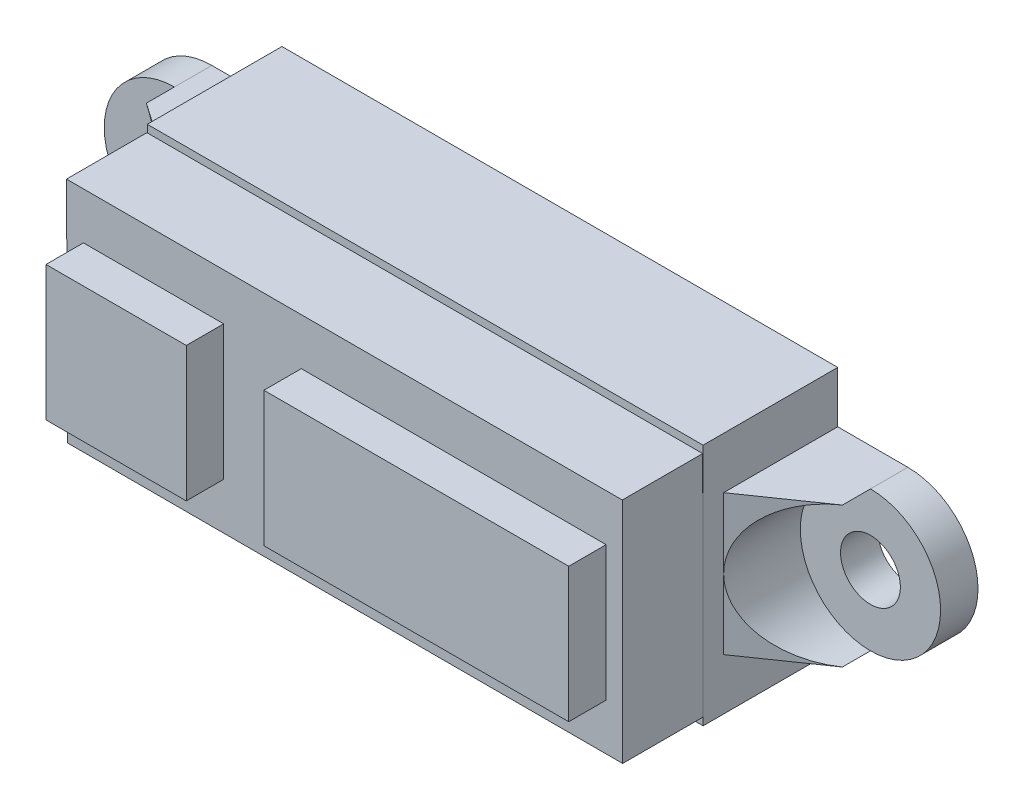
ISO-10303-21;
HEADER;
FILE_DESCRIPTION(('STEP AP214'),'2;1');
FILE_NAME('part.step','',(''),(''),'','','');
FILE_SCHEMA(('AUTOMOTIVE_DESIGN { 1 0 10303 214 1 1 1 1 }'));
ENDSEC;
DATA;
#1=APPLICATION_CONTEXT('core data for automotive mechanical design processes');
#2=APPLICATION_PROTOCOL_DEFINITION('international standard','automotive_design',2000,#1);
#3=PRODUCT_CONTEXT('',#1,'mechanical');
#4=PRODUCT('Part','Part','',(#3));
#5=PRODUCT_RELATED_PRODUCT_CATEGORY('part','',(#4));
#6=PRODUCT_DEFINITION_FORMATION('','',#4);
#7=PRODUCT_DEFINITION_CONTEXT('part definition',#1,'design');
#8=PRODUCT_DEFINITION('design','',#6,#7);
#9=PRODUCT_DEFINITION_SHAPE('','',#8);
#10=(LENGTH_UNIT() NAMED_UNIT(*) SI_UNIT(.MILLI.,.METRE.));
#11=(NAMED_UNIT(*) PLANE_ANGLE_UNIT() SI_UNIT($,.RADIAN.));
#12=(NAMED_UNIT(*) SI_UNIT($,.STERADIAN.) SOLID_ANGLE_UNIT());
#13=UNCERTAINTY_MEASURE_WITH_UNIT(LENGTH_MEASURE(1.E-05),#10,'distance_accuracy_value','');
#14=(GEOMETRIC_REPRESENTATION_CONTEXT(3) GLOBAL_UNCERTAINTY_ASSIGNED_CONTEXT((#13)) GLOBAL_UNIT_ASSIGNED_CONTEXT((#10,
#11,#12)) REPRESENTATION_CONTEXT('',''));
#15=CARTESIAN_POINT('',(0.,0.,0.));
#16=DIRECTION('',(0.,0.,1.));
#17=DIRECTION('',(1.,0.,0.));
#18=AXIS2_PLACEMENT_3D('',#15,#16,#17);
#19=CARTESIAN_POINT('',(14.859,6.5,7.2));
#20=DIRECTION('',(-1.,0.,0.));
#21=DIRECTION('',(0.,0.,1.));
#22=AXIS2_PLACEMENT_3D('',#19,#20,#21);
#23=PLANE('',#22);
#24=DIRECTION('',(0.,0.,-1.));
#25=VECTOR('',#24,1.);
#26=CARTESIAN_POINT('',(14.859,-3.75,2.));
#27=LINE('',#26,#25);
#28=CARTESIAN_POINT('',(14.859,-3.74999999999999,6.1));
#29=VERTEX_POINT('',#28);
#30=CARTESIAN_POINT('',(14.859,-3.74999999999999,0.));
#31=VERTEX_POINT('',#30);
#32=EDGE_CURVE('E444',#29,#31,#27,.T.);
#33=ORIENTED_EDGE('',*,*,#32,.F.);
#34=DIRECTION('',(0.,-1.,0.));
#35=VECTOR('',#34,1.);
#36=CARTESIAN_POINT('',(14.859,3.75000000000001,6.1));
#37=LINE('',#36,#35);
#38=CARTESIAN_POINT('',(14.859,0.,6.1));
#39=VERTEX_POINT('',#38);
#40=EDGE_CURVE('E267',#39,#29,#37,.T.);
#41=ORIENTED_EDGE('',*,*,#40,.F.);
#42=CARTESIAN_POINT('',(14.859,3.75,6.1));
#43=VERTEX_POINT('',#42);
#44=EDGE_CURVE('E245',#43,#39,#37,.T.);
#45=ORIENTED_EDGE('',*,*,#44,.F.);
#46=DIRECTION('',(0.,0.,-1.));
#47=VECTOR('',#46,1.);
#48=CARTESIAN_POINT('',(14.859,3.75,2.));
#49=LINE('',#48,#47);
#50=CARTESIAN_POINT('',(14.859,3.75,0.));
#51=VERTEX_POINT('',#50);
#52=EDGE_CURVE('E256',#43,#51,#49,.T.);
#53=ORIENTED_EDGE('',*,*,#52,.T.);
#54=DIRECTION('',(0.,1.,0.));
#55=VECTOR('',#54,1.);
#56=CARTESIAN_POINT('',(14.859,6.5,0.));
#57=LINE('',#56,#55);
#58=CARTESIAN_POINT('',(14.859,6.5,0.));
#59=VERTEX_POINT('',#58);
#60=EDGE_CURVE('E517',#51,#59,#57,.T.);
#61=ORIENTED_EDGE('',*,*,#60,.T.);
#62=DIRECTION('',(0.,0.,-1.));
#63=VECTOR('',#62,1.);
#64=CARTESIAN_POINT('',(14.859,6.5,7.2));
#65=LINE('',#64,#63);
#66=CARTESIAN_POINT('',(14.859,6.5,7.2));
#67=VERTEX_POINT('',#66);
#68=EDGE_CURVE('E320',#67,#59,#65,.T.);
#69=ORIENTED_EDGE('',*,*,#68,.F.);
#70=DIRECTION('',(0.,1.,0.));
#71=VECTOR('',#70,1.);
#72=CARTESIAN_POINT('',(14.859,6.5,7.2));
#73=LINE('',#72,#71);
#74=CARTESIAN_POINT('',(14.859,-6.09167956112435,7.2));
#75=VERTEX_POINT('',#74);
#76=EDGE_CURVE('E529',#75,#67,#73,.T.);
#77=ORIENTED_EDGE('',*,*,#76,.F.);
#78=CARTESIAN_POINT('',(14.859,-6.5,7.2));
#79=VERTEX_POINT('',#78);
#80=EDGE_CURVE('E526',#79,#75,#73,.T.);
#81=ORIENTED_EDGE('',*,*,#80,.F.);
#82=DIRECTION('',(0.,0.,-1.));
#83=VECTOR('',#82,1.);
#84=CARTESIAN_POINT('',(14.859,-6.5,7.2));
#85=LINE('',#84,#83);
#86=CARTESIAN_POINT('',(14.859,-6.5,0.));
#87=VERTEX_POINT('',#86);
#88=EDGE_CURVE('E492',#79,#87,#85,.T.);
#89=ORIENTED_EDGE('',*,*,#88,.T.);
#90=EDGE_CURVE('E516',#87,#31,#57,.T.);
#91=ORIENTED_EDGE('',*,*,#90,.T.);
#92=EDGE_LOOP('',(#33,#41,#45,#53,#61,#69,#77,#81,#89,#91));
#93=FACE_BOUND('',#92,.T.);
#94=ADVANCED_FACE('F35',(#93),#23,.F.);
#95=CARTESIAN_POINT('',(18.609,0.,2.));
#96=DIRECTION('',(0.,0.,1.));
#97=DIRECTION('',(1.,0.,0.));
#98=AXIS2_PLACEMENT_3D('',#95,#96,#97);
#99=PLANE('',#98);
#100=CARTESIAN_POINT('',(18.609,0.,2.));
#101=DIRECTION('',(0.,0.,-1.));
#102=DIRECTION('',(1.,0.,0.));
#103=AXIS2_PLACEMENT_3D('',#100,#101,#102);
#104=CIRCLE('',#103,3.75);
#105=CARTESIAN_POINT('',(18.609,3.75,2.));
#106=VERTEX_POINT('',#105);
#107=CARTESIAN_POINT('',(18.609,-3.75,2.));
#108=VERTEX_POINT('',#107);
#109=EDGE_CURVE('E445',#106,#108,#104,.T.);
#110=ORIENTED_EDGE('',*,*,#109,.F.);
#111=CARTESIAN_POINT('',(18.609,0.,2.));
#112=DIRECTION('',(0.,0.,1.));
#113=DIRECTION('',(-1.,0.,0.));
#114=AXIS2_PLACEMENT_3D('',#111,#112,#113);
#115=CIRCLE('',#114,3.75);
#116=EDGE_CURVE('E261',#106,#108,#115,.T.);
#117=ORIENTED_EDGE('',*,*,#116,.T.);
#118=EDGE_LOOP('',(#110,#117));
#119=FACE_BOUND('',#118,.T.);
#120=CARTESIAN_POINT('',(18.609,0.,2.));
#121=DIRECTION('',(0.,0.,-1.));
#122=DIRECTION('',(1.,0.,0.));
#123=AXIS2_PLACEMENT_3D('',#120,#121,#122);
#124=CIRCLE('',#123,1.6);
#125=CARTESIAN_POINT('',(20.209,0.,2.));
#126=VERTEX_POINT('',#125);
#127=EDGE_CURVE('E459',#126,#126,#124,.T.);
#128=ORIENTED_EDGE('',*,*,#127,.T.);
#129=EDGE_LOOP('',(#128));
#130=FACE_BOUND('',#129,.T.);
#131=ADVANCED_FACE('F599',(#119,#130),#99,.T.);
#132=CARTESIAN_POINT('',(-14.859,6.5,7.2));
#133=DIRECTION('',(1.,0.,0.));
#134=DIRECTION('',(0.,1.,0.));
#135=AXIS2_PLACEMENT_3D('',#132,#133,#134);
#136=PLANE('',#135);
#137=DIRECTION('',(0.,1.,0.));
#138=VECTOR('',#137,1.);
#139=CARTESIAN_POINT('',(-14.859,3.75000000000001,6.1));
#140=LINE('',#139,#138);
#141=CARTESIAN_POINT('',(-14.859,-3.74999999999999,6.1));
#142=VERTEX_POINT('',#141);
#143=CARTESIAN_POINT('',(-14.859,0.,6.1));
#144=VERTEX_POINT('',#143);
#145=EDGE_CURVE('E271',#142,#144,#140,.T.);
#146=ORIENTED_EDGE('',*,*,#145,.F.);
#147=DIRECTION('',(0.,0.,-1.));
#148=VECTOR('',#147,1.);
#149=CARTESIAN_POINT('',(-14.859,-3.74999999999999,2.));
#150=LINE('',#149,#148);
#151=CARTESIAN_POINT('',(-14.859,-3.74999999999999,0.));
#152=VERTEX_POINT('',#151);
#153=EDGE_CURVE('E420',#142,#152,#150,.T.);
#154=ORIENTED_EDGE('',*,*,#153,.T.);
#155=DIRECTION('',(0.,-1.,0.));
#156=VECTOR('',#155,1.);
#157=CARTESIAN_POINT('',(-14.859,6.5,0.));
#158=LINE('',#157,#156);
#159=CARTESIAN_POINT('',(-14.859,-6.5,0.));
#160=VERTEX_POINT('',#159);
#161=EDGE_CURVE('E513',#152,#160,#158,.T.);
#162=ORIENTED_EDGE('',*,*,#161,.T.);
#163=DIRECTION('',(0.,0.,-1.));
#164=VECTOR('',#163,1.);
#165=CARTESIAN_POINT('',(-14.859,-6.5,7.2));
#166=LINE('',#165,#164);
#167=CARTESIAN_POINT('',(-14.859,-6.5,7.2));
#168=VERTEX_POINT('',#167);
#169=EDGE_CURVE('E495',#168,#160,#166,.T.);
#170=ORIENTED_EDGE('',*,*,#169,.F.);
#171=DIRECTION('',(0.,-1.,0.));
#172=VECTOR('',#171,1.);
#173=CARTESIAN_POINT('',(-14.859,6.5,7.2));
#174=LINE('',#173,#172);
#175=CARTESIAN_POINT('',(-14.859,2.03244411990558,7.2));
#176=VERTEX_POINT('',#175);
#177=EDGE_CURVE('E523',#176,#168,#174,.T.);
#178=ORIENTED_EDGE('',*,*,#177,.F.);
#179=CARTESIAN_POINT('',(-14.859,6.10016269502376,7.2));
#180=VERTEX_POINT('',#179);
#181=EDGE_CURVE('E522',#180,#176,#174,.T.);
#182=ORIENTED_EDGE('',*,*,#181,.F.);
#183=CARTESIAN_POINT('',(-14.859,6.5,7.2));
#184=VERTEX_POINT('',#183);
#185=EDGE_CURVE('E507',#184,#180,#174,.T.);
#186=ORIENTED_EDGE('',*,*,#185,.F.);
#187=DIRECTION('',(0.,0.,-1.));
#188=VECTOR('',#187,1.);
#189=CARTESIAN_POINT('',(-14.859,6.5,7.2));
#190=LINE('',#189,#188);
#191=CARTESIAN_POINT('',(-14.859,6.5,0.));
#192=VERTEX_POINT('',#191);
#193=EDGE_CURVE('E328',#184,#192,#190,.T.);
#194=ORIENTED_EDGE('',*,*,#193,.T.);
#195=CARTESIAN_POINT('',(-14.859,3.75000000000001,0.));
#196=VERTEX_POINT('',#195);
#197=EDGE_CURVE('E487',#192,#196,#158,.T.);
#198=ORIENTED_EDGE('',*,*,#197,.T.);
#199=DIRECTION('',(0.,0.,-1.));
#200=VECTOR('',#199,1.);
#201=CARTESIAN_POINT('',(-14.859,3.75000000000001,2.));
#202=LINE('',#201,#200);
#203=CARTESIAN_POINT('',(-14.859,3.75,6.1));
#204=VERTEX_POINT('',#203);
#205=EDGE_CURVE('E416',#204,#196,#202,.T.);
#206=ORIENTED_EDGE('',*,*,#205,.F.);
#207=EDGE_CURVE('E265',#144,#204,#140,.T.);
#208=ORIENTED_EDGE('',*,*,#207,.F.);
#209=EDGE_LOOP('',(#146,#154,#162,#170,#178,#182,#186,#194,#198,#206,#208));
#210=FACE_BOUND('',#209,.T.);
#211=ADVANCED_FACE('F504',(#210),#136,.F.);
#212=CARTESIAN_POINT('',(-18.609,0.,2.));
#213=DIRECTION('',(0.,0.,-1.));
#214=DIRECTION('',(-1.,0.,0.));
#215=AXIS2_PLACEMENT_3D('',#212,#213,#214);
#216=PLANE('',#215);
#217=CARTESIAN_POINT('',(-18.609,0.,2.));
#218=DIRECTION('',(0.,0.,-1.));
#219=DIRECTION('',(-1.,0.,0.));
#220=AXIS2_PLACEMENT_3D('',#217,#218,#219);
#221=CIRCLE('',#220,1.6);
#222=CARTESIAN_POINT('',(-20.209,0.,2.));
#223=VERTEX_POINT('',#222);
#224=EDGE_CURVE('E433',#223,#223,#221,.T.);
#225=ORIENTED_EDGE('',*,*,#224,.T.);
#226=EDGE_LOOP('',(#225));
#227=FACE_BOUND('',#226,.T.);
#228=CARTESIAN_POINT('',(-18.609,0.,2.));
#229=DIRECTION('',(0.,0.,1.));
#230=DIRECTION('',(1.,0.,0.));
#231=AXIS2_PLACEMENT_3D('',#228,#229,#230);
#232=CIRCLE('',#231,3.75);
#233=CARTESIAN_POINT('',(-18.609,-3.75,2.));
#234=VERTEX_POINT('',#233);
#235=CARTESIAN_POINT('',(-18.609,3.75,2.));
#236=VERTEX_POINT('',#235);
#237=EDGE_CURVE('E581',#234,#236,#232,.T.);
#238=ORIENTED_EDGE('',*,*,#237,.T.);
#239=CARTESIAN_POINT('',(-18.609,0.,2.));
#240=DIRECTION('',(0.,0.,-1.));
#241=DIRECTION('',(-1.,0.,0.));
#242=AXIS2_PLACEMENT_3D('',#239,#240,#241);
#243=CIRCLE('',#242,3.75);
#244=EDGE_CURVE('E417',#234,#236,#243,.T.);
#245=ORIENTED_EDGE('',*,*,#244,.F.);
#246=EDGE_LOOP('',(#238,#245));
#247=FACE_BOUND('',#246,.T.);
#248=ADVANCED_FACE('F641',(#227,#247),#216,.F.);
#249=CARTESIAN_POINT('',(-14.859,-6.5,7.2));
#250=DIRECTION('',(0.,1.,0.));
#251=DIRECTION('',(0.,0.,1.));
#252=AXIS2_PLACEMENT_3D('',#249,#250,#251);
#253=PLANE('',#252);
#254=DIRECTION('',(0.,0.,-1.));
#255=VECTOR('',#254,1.);
#256=CARTESIAN_POINT('',(-5.05,-6.49999999999999,5.));
#257=LINE('',#256,#255);
#258=CARTESIAN_POINT('',(-5.05,-6.49999999999999,5.));
#259=VERTEX_POINT('',#258);
#260=CARTESIAN_POINT('',(-5.05,-6.49999999999999,0.));
#261=VERTEX_POINT('',#260);
#262=EDGE_CURVE('E303',#259,#261,#257,.T.);
#263=ORIENTED_EDGE('',*,*,#262,.F.);
#264=DIRECTION('',(1.,0.,0.));
#265=VECTOR('',#264,1.);
#266=CARTESIAN_POINT('',(5.05,-6.49999999999999,5.));
#267=LINE('',#266,#265);
#268=CARTESIAN_POINT('',(5.05,-6.49999999999999,5.));
#269=VERTEX_POINT('',#268);
#270=EDGE_CURVE('E287',#259,#269,#267,.T.);
#271=ORIENTED_EDGE('',*,*,#270,.T.);
#272=DIRECTION('',(0.,0.,-1.));
#273=VECTOR('',#272,1.);
#274=CARTESIAN_POINT('',(5.05,-6.49999999999999,5.));
#275=LINE('',#274,#273);
#276=CARTESIAN_POINT('',(5.05,-6.5,0.));
#277=VERTEX_POINT('',#276);
#278=EDGE_CURVE('E299',#269,#277,#275,.T.);
#279=ORIENTED_EDGE('',*,*,#278,.T.);
#280=DIRECTION('',(1.,0.,0.));
#281=VECTOR('',#280,1.);
#282=CARTESIAN_POINT('',(-14.859,-6.5,0.));
#283=LINE('',#282,#281);
#284=EDGE_CURVE('E482',#277,#87,#283,.T.);
#285=ORIENTED_EDGE('',*,*,#284,.T.);
#286=ORIENTED_EDGE('',*,*,#88,.F.);
#287=DIRECTION('',(1.,0.,0.));
#288=VECTOR('',#287,1.);
#289=CARTESIAN_POINT('',(-14.859,-6.5,7.2));
#290=LINE('',#289,#288);
#291=EDGE_CURVE('E496',#168,#79,#290,.T.);
#292=ORIENTED_EDGE('',*,*,#291,.F.);
#293=ORIENTED_EDGE('',*,*,#169,.T.);
#294=EDGE_CURVE('E486',#160,#261,#283,.T.);
#295=ORIENTED_EDGE('',*,*,#294,.T.);
#296=EDGE_LOOP('',(#263,#271,#279,#285,#286,#292,#293,#295));
#297=FACE_BOUND('',#296,.T.);
#298=ADVANCED_FACE('F557',(#297),#253,.F.);
#299=CARTESIAN_POINT('',(0.,0.,11.5));
#300=DIRECTION('',(0.,0.,1.));
#301=DIRECTION('',(1.,0.,0.));
#302=AXIS2_PLACEMENT_3D('',#299,#300,#301);
#303=PLANE('',#302);
#304=DIRECTION('',(0.,1.,0.));
#305=VECTOR('',#304,1.);
#306=CARTESIAN_POINT('',(13.975,3.6,11.5));
#307=LINE('',#306,#305);
#308=CARTESIAN_POINT('',(13.975,-3.6,11.5));
#309=VERTEX_POINT('',#308);
#310=CARTESIAN_POINT('',(13.975,3.6,11.5));
#311=VERTEX_POINT('',#310);
#312=EDGE_CURVE('E372',#309,#311,#307,.T.);
#313=ORIENTED_EDGE('',*,*,#312,.F.);
#314=DIRECTION('',(1.,0.,0.));
#315=VECTOR('',#314,1.);
#316=CARTESIAN_POINT('',(13.975,-3.6,11.5));
#317=LINE('',#316,#315);
#318=CARTESIAN_POINT('',(-2.325,-3.6,11.5));
#319=VERTEX_POINT('',#318);
#320=EDGE_CURVE('E374',#319,#309,#317,.T.);
#321=ORIENTED_EDGE('',*,*,#320,.F.);
#322=DIRECTION('',(0.,-1.,0.));
#323=VECTOR('',#322,1.);
#324=CARTESIAN_POINT('',(-2.325,3.6,11.5));
#325=LINE('',#324,#323);
#326=CARTESIAN_POINT('',(-2.325,3.6,11.5));
#327=VERTEX_POINT('',#326);
#328=EDGE_CURVE('E366',#327,#319,#325,.T.);
#329=ORIENTED_EDGE('',*,*,#328,.F.);
#330=DIRECTION('',(-1.,0.,0.));
#331=VECTOR('',#330,1.);
#332=CARTESIAN_POINT('',(13.975,3.6,11.5));
#333=LINE('',#332,#331);
#334=EDGE_CURVE('E369',#311,#327,#333,.T.);
#335=ORIENTED_EDGE('',*,*,#334,.F.);
#336=EDGE_LOOP('',(#313,#321,#329,#335));
#337=FACE_BOUND('',#336,.T.);
#338=DIRECTION('',(-0.00169722294380295,0.999998559716102,0.));
#339=VECTOR('',#338,1.);
#340=CARTESIAN_POINT('',(14.8383076957928,6.10016269502376,11.5));
#341=LINE('',#340,#339);
#342=CARTESIAN_POINT('',(14.859,-6.09167956112435,11.5));
#343=VERTEX_POINT('',#342);
#344=CARTESIAN_POINT('',(14.8383076957928,6.10016269502376,11.5));
#345=VERTEX_POINT('',#344);
#346=EDGE_CURVE('E337',#343,#345,#341,.T.);
#347=ORIENTED_EDGE('',*,*,#346,.T.);
#348=DIRECTION('',(-1.,0.,0.));
#349=VECTOR('',#348,1.);
#350=CARTESIAN_POINT('',(-14.8796923042072,6.10016269502376,11.5));
#351=LINE('',#350,#349);
#352=CARTESIAN_POINT('',(-14.8796923042072,6.10016269502376,11.5));
#353=VERTEX_POINT('',#352);
#354=EDGE_CURVE('E352',#345,#353,#351,.T.);
#355=ORIENTED_EDGE('',*,*,#354,.T.);
#356=DIRECTION('',(0.00508688988720899,-0.999987061691938,0.));
#357=VECTOR('',#356,1.);
#358=CARTESIAN_POINT('',(-14.8796923042072,6.10016269502376,11.5));
#359=LINE('',#358,#357);
#360=CARTESIAN_POINT('',(-14.8176729427023,-6.09167956112435,11.5));
#361=VERTEX_POINT('',#360);
#362=EDGE_CURVE('E350',#353,#361,#359,.T.);
#363=ORIENTED_EDGE('',*,*,#362,.T.);
#364=DIRECTION('',(1.,0.,0.));
#365=VECTOR('',#364,1.);
#366=CARTESIAN_POINT('',(-14.8176729427023,-6.09167956112435,11.5));
#367=LINE('',#366,#365);
#368=EDGE_CURVE('E347',#361,#343,#367,.T.);
#369=ORIENTED_EDGE('',*,*,#368,.T.);
#370=EDGE_LOOP('',(#347,#355,#363,#369));
#371=FACE_BOUND('',#370,.T.);
#372=DIRECTION('',(1.,0.,0.));
#373=VECTOR('',#372,1.);
#374=CARTESIAN_POINT('',(-13.975,-3.6,11.5));
#375=LINE('',#374,#373);
#376=CARTESIAN_POINT('',(-13.975,-3.6,11.5));
#377=VERTEX_POINT('',#376);
#378=CARTESIAN_POINT('',(-6.475,-3.6,11.5));
#379=VERTEX_POINT('',#378);
#380=EDGE_CURVE('E401',#377,#379,#375,.T.);
#381=ORIENTED_EDGE('',*,*,#380,.F.);
#382=DIRECTION('',(0.,-1.,0.));
#383=VECTOR('',#382,1.);
#384=CARTESIAN_POINT('',(-13.975,3.6,11.5));
#385=LINE('',#384,#383);
#386=CARTESIAN_POINT('',(-13.975,3.6,11.5));
#387=VERTEX_POINT('',#386);
#388=EDGE_CURVE('E403',#387,#377,#385,.T.);
#389=ORIENTED_EDGE('',*,*,#388,.F.);
#390=DIRECTION('',(-1.,0.,0.));
#391=VECTOR('',#390,1.);
#392=CARTESIAN_POINT('',(-13.975,3.6,11.5));
#393=LINE('',#392,#391);
#394=CARTESIAN_POINT('',(-6.475,3.6,11.5));
#395=VERTEX_POINT('',#394);
#396=EDGE_CURVE('E395',#395,#387,#393,.T.);
#397=ORIENTED_EDGE('',*,*,#396,.F.);
#398=DIRECTION('',(0.,1.,0.));
#399=VECTOR('',#398,1.);
#400=CARTESIAN_POINT('',(-6.475,3.6,11.5));
#401=LINE('',#400,#399);
#402=EDGE_CURVE('E398',#379,#395,#401,.T.);
#403=ORIENTED_EDGE('',*,*,#402,.F.);
#404=EDGE_LOOP('',(#381,#389,#397,#403));
#405=FACE_BOUND('',#404,.T.);
#406=ADVANCED_FACE('F655',(#337,#371,#405),#303,.T.);
#407=CARTESIAN_POINT('',(0.,0.,7.2));
#408=DIRECTION('',(0.,0.,1.));
#409=DIRECTION('',(1.,0.,0.));
#410=AXIS2_PLACEMENT_3D('',#407,#408,#409);
#411=PLANE('',#410);
#412=DIRECTION('',(0.00508688988720899,-0.999987061691938,0.));
#413=VECTOR('',#412,1.);
#414=CARTESIAN_POINT('',(-14.8796923042072,6.10016269502376,7.2));
#415=LINE('',#414,#413);
#416=CARTESIAN_POINT('',(-14.8176729427023,-6.09167956112435,7.2));
#417=VERTEX_POINT('',#416);
#418=EDGE_CURVE('E314',#176,#417,#415,.T.);
#419=ORIENTED_EDGE('',*,*,#418,.F.);
#420=ORIENTED_EDGE('',*,*,#177,.T.);
#421=ORIENTED_EDGE('',*,*,#291,.T.);
#422=ORIENTED_EDGE('',*,*,#80,.T.);
#423=DIRECTION('',(1.,0.,0.));
#424=VECTOR('',#423,1.);
#425=CARTESIAN_POINT('',(-14.8176729427023,-6.09167956112435,7.2));
#426=LINE('',#425,#424);
#427=EDGE_CURVE('E332',#417,#75,#426,.T.);
#428=ORIENTED_EDGE('',*,*,#427,.F.);
#429=EDGE_LOOP('',(#419,#420,#421,#422,#428));
#430=FACE_BOUND('',#429,.T.);
#431=ADVANCED_FACE('F546',(#430),#411,.T.);
#432=CARTESIAN_POINT('',(-14.859,6.5,7.2));
#433=DIRECTION('',(0.,-1.,0.));
#434=DIRECTION('',(0.,0.,-1.));
#435=AXIS2_PLACEMENT_3D('',#432,#433,#434);
#436=PLANE('',#435);
#437=DIRECTION('',(-1.,0.,0.));
#438=VECTOR('',#437,1.);
#439=CARTESIAN_POINT('',(-14.859,6.5,0.));
#440=LINE('',#439,#438);
#441=EDGE_CURVE('E511',#59,#192,#440,.T.);
#442=ORIENTED_EDGE('',*,*,#441,.T.);
#443=ORIENTED_EDGE('',*,*,#193,.F.);
#444=DIRECTION('',(-1.,0.,0.));
#445=VECTOR('',#444,1.);
#446=CARTESIAN_POINT('',(-14.859,6.5,7.2));
#447=LINE('',#446,#445);
#448=EDGE_CURVE('E524',#67,#184,#447,.T.);
#449=ORIENTED_EDGE('',*,*,#448,.F.);
#450=ORIENTED_EDGE('',*,*,#68,.T.);
#451=EDGE_LOOP('',(#442,#443,#449,#450));
#452=FACE_BOUND('',#451,.T.);
#453=ADVANCED_FACE('F622',(#452),#436,.F.);
#454=DIRECTION('',(-0.00169722294380295,0.999998559716102,0.));
#455=VECTOR('',#454,1.);
#456=CARTESIAN_POINT('',(14.8383076957928,6.10016269502376,7.2));
#457=LINE('',#456,#455);
#458=CARTESIAN_POINT('',(14.8383076957928,6.10016269502376,7.2));
#459=VERTEX_POINT('',#458);
#460=EDGE_CURVE('E342',#75,#459,#457,.T.);
#461=ORIENTED_EDGE('',*,*,#460,.F.);
#462=ORIENTED_EDGE('',*,*,#76,.T.);
#463=ORIENTED_EDGE('',*,*,#448,.T.);
#464=ORIENTED_EDGE('',*,*,#185,.T.);
#465=DIRECTION('',(-1.,0.,0.));
#466=VECTOR('',#465,1.);
#467=CARTESIAN_POINT('',(-14.8796923042072,6.10016269502376,7.2));
#468=LINE('',#467,#466);
#469=EDGE_CURVE('E333',#459,#180,#468,.T.);
#470=ORIENTED_EDGE('',*,*,#469,.F.);
#471=EDGE_LOOP('',(#461,#462,#463,#464,#470));
#472=FACE_BOUND('',#471,.T.);
#473=ADVANCED_FACE('F614',(#472),#411,.T.);
#474=CARTESIAN_POINT('',(0.,0.,0.));
#475=DIRECTION('',(0.,0.,1.));
#476=DIRECTION('',(1.,0.,0.));
#477=AXIS2_PLACEMENT_3D('',#474,#475,#476);
#478=PLANE('',#477);
#479=ORIENTED_EDGE('',*,*,#90,.F.);
#480=ORIENTED_EDGE('',*,*,#284,.F.);
#481=DIRECTION('',(0.,-1.,0.));
#482=VECTOR('',#481,1.);
#483=CARTESIAN_POINT('',(5.05,-6.49999999999999,0.));
#484=LINE('',#483,#482);
#485=CARTESIAN_POINT('',(5.05,-12.5,0.));
#486=VERTEX_POINT('',#485);
#487=EDGE_CURVE('E55',#277,#486,#484,.T.);
#488=ORIENTED_EDGE('',*,*,#487,.T.);
#489=DIRECTION('',(-1.,0.,0.));
#490=VECTOR('',#489,1.);
#491=CARTESIAN_POINT('',(5.05,-12.5,0.));
#492=LINE('',#491,#490);
#493=CARTESIAN_POINT('',(-5.05,-12.5,0.));
#494=VERTEX_POINT('',#493);
#495=EDGE_CURVE('E291',#486,#494,#492,.T.);
#496=ORIENTED_EDGE('',*,*,#495,.T.);
#497=DIRECTION('',(0.,1.,0.));
#498=VECTOR('',#497,1.);
#499=CARTESIAN_POINT('',(-5.05,-6.49999999999999,0.));
#500=LINE('',#499,#498);
#501=EDGE_CURVE('E282',#494,#261,#500,.T.);
#502=ORIENTED_EDGE('',*,*,#501,.T.);
#503=ORIENTED_EDGE('',*,*,#294,.F.);
#504=ORIENTED_EDGE('',*,*,#161,.F.);
#505=DIRECTION('',(-1.,0.,0.));
#506=VECTOR('',#505,1.);
#507=CARTESIAN_POINT('',(-18.609,-3.74999999999999,0.));
#508=LINE('',#507,#506);
#509=CARTESIAN_POINT('',(-18.609,-3.74999999999999,0.));
#510=VERTEX_POINT('',#509);
#511=EDGE_CURVE('E424',#152,#510,#508,.T.);
#512=ORIENTED_EDGE('',*,*,#511,.T.);
#513=CARTESIAN_POINT('',(-18.609,0.,0.));
#514=DIRECTION('',(0.,0.,-1.));
#515=DIRECTION('',(-1.,0.,0.));
#516=AXIS2_PLACEMENT_3D('',#513,#514,#515);
#517=CIRCLE('',#516,3.75);
#518=CARTESIAN_POINT('',(-18.609,3.75000000000001,0.));
#519=VERTEX_POINT('',#518);
#520=EDGE_CURVE('E430',#510,#519,#517,.T.);
#521=ORIENTED_EDGE('',*,*,#520,.T.);
#522=DIRECTION('',(1.,0.,0.));
#523=VECTOR('',#522,1.);
#524=CARTESIAN_POINT('',(-18.609,3.75000000000001,0.));
#525=LINE('',#524,#523);
#526=EDGE_CURVE('E427',#519,#196,#525,.T.);
#527=ORIENTED_EDGE('',*,*,#526,.T.);
#528=ORIENTED_EDGE('',*,*,#197,.F.);
#529=ORIENTED_EDGE('',*,*,#441,.F.);
#530=ORIENTED_EDGE('',*,*,#60,.F.);
#531=DIRECTION('',(1.,0.,0.));
#532=VECTOR('',#531,1.);
#533=CARTESIAN_POINT('',(18.609,3.75,0.));
#534=LINE('',#533,#532);
#535=CARTESIAN_POINT('',(18.609,3.75,0.));
#536=VERTEX_POINT('',#535);
#537=EDGE_CURVE('E450',#51,#536,#534,.T.);
#538=ORIENTED_EDGE('',*,*,#537,.T.);
#539=CARTESIAN_POINT('',(18.609,0.,0.));
#540=DIRECTION('',(0.,0.,-1.));
#541=DIRECTION('',(1.,0.,0.));
#542=AXIS2_PLACEMENT_3D('',#539,#540,#541);
#543=CIRCLE('',#542,3.75);
#544=CARTESIAN_POINT('',(18.609,-3.75,0.));
#545=VERTEX_POINT('',#544);
#546=EDGE_CURVE('E456',#536,#545,#543,.T.);
#547=ORIENTED_EDGE('',*,*,#546,.T.);
#548=DIRECTION('',(-1.,0.,0.));
#549=VECTOR('',#548,1.);
#550=CARTESIAN_POINT('',(18.609,-3.75,0.));
#551=LINE('',#550,#549);
#552=EDGE_CURVE('E453',#545,#31,#551,.T.);
#553=ORIENTED_EDGE('',*,*,#552,.T.);
#554=EDGE_LOOP('',(#479,#480,#488,#496,#502,#503,#504,#512,#521,#527,#528,#529,#530,#538,#547,#553));
#555=FACE_BOUND('',#554,.T.);
#556=CARTESIAN_POINT('',(-18.609,0.,0.));
#557=DIRECTION('',(0.,0.,-1.));
#558=DIRECTION('',(-1.,0.,0.));
#559=AXIS2_PLACEMENT_3D('',#556,#557,#558);
#560=CIRCLE('',#559,1.6);
#561=CARTESIAN_POINT('',(-20.209,0.,0.));
#562=VERTEX_POINT('',#561);
#563=EDGE_CURVE('E436',#562,#562,#560,.T.);
#564=ORIENTED_EDGE('',*,*,#563,.F.);
#565=EDGE_LOOP('',(#564));
#566=FACE_BOUND('',#565,.T.);
#567=CARTESIAN_POINT('',(18.609,0.,0.));
#568=DIRECTION('',(0.,0.,-1.));
#569=DIRECTION('',(1.,0.,0.));
#570=AXIS2_PLACEMENT_3D('',#567,#568,#569);
#571=CIRCLE('',#570,1.6);
#572=CARTESIAN_POINT('',(20.209,0.,0.));
#573=VERTEX_POINT('',#572);
#574=EDGE_CURVE('E302',#573,#573,#571,.T.);
#575=ORIENTED_EDGE('',*,*,#574,.F.);
#576=EDGE_LOOP('',(#575));
#577=FACE_BOUND('',#576,.T.);
#578=ADVANCED_FACE('F478',(#555,#566,#577),#478,.F.);
#579=CARTESIAN_POINT('',(0.,0.,7.2));
#580=DIRECTION('',(0.,0.,1.));
#581=DIRECTION('',(1.,0.,0.));
#582=AXIS2_PLACEMENT_3D('',#579,#580,#581);
#583=PLANE('',#582);
#584=CARTESIAN_POINT('',(-14.8796923042072,6.10016269502376,7.2));
#585=VERTEX_POINT('',#584);
#586=EDGE_CURVE('E339',#180,#585,#468,.T.);
#587=ORIENTED_EDGE('',*,*,#586,.F.);
#588=ORIENTED_EDGE('',*,*,#181,.T.);
#589=EDGE_CURVE('E322',#585,#176,#415,.T.);
#590=ORIENTED_EDGE('',*,*,#589,.F.);
#591=EDGE_LOOP('',(#587,#588,#590));
#592=FACE_BOUND('',#591,.T.);
#593=ADVANCED_FACE('F613',(#592),#583,.F.);
#594=CARTESIAN_POINT('',(14.8383076957928,6.10016269502376,11.5));
#595=DIRECTION('',(-0.999998559716102,-0.00169722294380295,0.));
#596=DIRECTION('',(0.00169722294380295,-0.999998559716102,0.));
#597=AXIS2_PLACEMENT_3D('',#594,#595,#596);
#598=PLANE('',#597);
#599=ORIENTED_EDGE('',*,*,#460,.T.);
#600=DIRECTION('',(0.,0.,-1.));
#601=VECTOR('',#600,1.);
#602=CARTESIAN_POINT('',(14.8383076957928,6.10016269502376,11.5));
#603=LINE('',#602,#601);
#604=EDGE_CURVE('E530',#345,#459,#603,.T.);
#605=ORIENTED_EDGE('',*,*,#604,.F.);
#606=ORIENTED_EDGE('',*,*,#346,.F.);
#607=DIRECTION('',(0.,0.,-1.));
#608=VECTOR('',#607,1.);
#609=CARTESIAN_POINT('',(14.859,-6.09167956112435,11.5));
#610=LINE('',#609,#608);
#611=EDGE_CURVE('E349',#343,#75,#610,.T.);
#612=ORIENTED_EDGE('',*,*,#611,.T.);
#613=EDGE_LOOP('',(#599,#605,#606,#612));
#614=FACE_BOUND('',#613,.T.);
#615=ADVANCED_FACE('F540',(#614),#598,.F.);
#616=CARTESIAN_POINT('',(-14.8796923042072,6.10016269502376,11.5));
#617=DIRECTION('',(0.,-1.,0.));
#618=DIRECTION('',(0.,0.,-1.));
#619=AXIS2_PLACEMENT_3D('',#616,#617,#618);
#620=PLANE('',#619);
#621=ORIENTED_EDGE('',*,*,#469,.T.);
#622=ORIENTED_EDGE('',*,*,#586,.T.);
#623=DIRECTION('',(0.,0.,-1.));
#624=VECTOR('',#623,1.);
#625=CARTESIAN_POINT('',(-14.8796923042072,6.10016269502376,11.5));
#626=LINE('',#625,#624);
#627=EDGE_CURVE('E532',#353,#585,#626,.T.);
#628=ORIENTED_EDGE('',*,*,#627,.F.);
#629=ORIENTED_EDGE('',*,*,#354,.F.);
#630=ORIENTED_EDGE('',*,*,#604,.T.);
#631=EDGE_LOOP('',(#621,#622,#628,#629,#630));
#632=FACE_BOUND('',#631,.T.);
#633=ADVANCED_FACE('F695',(#632),#620,.F.);
#634=CARTESIAN_POINT('',(-14.8796923042072,6.10016269502376,11.5));
#635=DIRECTION('',(0.999987061691938,0.00508688988720899,0.));
#636=DIRECTION('',(-0.005086889887209,0.999987061691938,0.));
#637=AXIS2_PLACEMENT_3D('',#634,#635,#636);
#638=PLANE('',#637);
#639=ORIENTED_EDGE('',*,*,#589,.T.);
#640=ORIENTED_EDGE('',*,*,#418,.T.);
#641=DIRECTION('',(0.,0.,-1.));
#642=VECTOR('',#641,1.);
#643=CARTESIAN_POINT('',(-14.8176729427023,-6.09167956112435,11.5));
#644=LINE('',#643,#642);
#645=EDGE_CURVE('E534',#361,#417,#644,.T.);
#646=ORIENTED_EDGE('',*,*,#645,.F.);
#647=ORIENTED_EDGE('',*,*,#362,.F.);
#648=ORIENTED_EDGE('',*,*,#627,.T.);
#649=EDGE_LOOP('',(#639,#640,#646,#647,#648));
#650=FACE_BOUND('',#649,.T.);
#651=ADVANCED_FACE('F704',(#650),#638,.F.);
#652=CARTESIAN_POINT('',(-14.8176729427023,-6.09167956112435,11.5));
#653=DIRECTION('',(0.,1.,0.));
#654=DIRECTION('',(0.,0.,1.));
#655=AXIS2_PLACEMENT_3D('',#652,#653,#654);
#656=PLANE('',#655);
#657=ORIENTED_EDGE('',*,*,#427,.T.);
#658=ORIENTED_EDGE('',*,*,#611,.F.);
#659=ORIENTED_EDGE('',*,*,#368,.F.);
#660=ORIENTED_EDGE('',*,*,#645,.T.);
#661=EDGE_LOOP('',(#657,#658,#659,#660));
#662=FACE_BOUND('',#661,.T.);
#663=ADVANCED_FACE('F544',(#662),#656,.F.);
#664=CARTESIAN_POINT('',(13.975,-3.6,13.5));
#665=DIRECTION('',(0.,1.,0.));
#666=DIRECTION('',(-1.,0.,0.));
#667=AXIS2_PLACEMENT_3D('',#664,#665,#666);
#668=PLANE('',#667);
#669=ORIENTED_EDGE('',*,*,#320,.T.);
#670=DIRECTION('',(0.,0.,-1.));
#671=VECTOR('',#670,1.);
#672=CARTESIAN_POINT('',(13.975,-3.6,13.5));
#673=LINE('',#672,#671);
#674=CARTESIAN_POINT('',(13.975,-3.6,13.5));
#675=VERTEX_POINT('',#674);
#676=EDGE_CURVE('E346',#675,#309,#673,.T.);
#677=ORIENTED_EDGE('',*,*,#676,.F.);
#678=DIRECTION('',(1.,0.,0.));
#679=VECTOR('',#678,1.);
#680=CARTESIAN_POINT('',(13.975,-3.6,13.5));
#681=LINE('',#680,#679);
#682=CARTESIAN_POINT('',(-2.325,-3.6,13.5));
#683=VERTEX_POINT('',#682);
#684=EDGE_CURVE('E368',#683,#675,#681,.T.);
#685=ORIENTED_EDGE('',*,*,#684,.F.);
#686=DIRECTION('',(0.,0.,-1.));
#687=VECTOR('',#686,1.);
#688=CARTESIAN_POINT('',(-2.325,-3.6,13.5));
#689=LINE('',#688,#687);
#690=EDGE_CURVE('E362',#683,#319,#689,.T.);
#691=ORIENTED_EDGE('',*,*,#690,.T.);
#692=EDGE_LOOP('',(#669,#677,#685,#691));
#693=FACE_BOUND('',#692,.T.);
#694=ADVANCED_FACE('F719',(#693),#668,.F.);
#695=CARTESIAN_POINT('',(13.975,3.6,13.5));
#696=DIRECTION('',(-1.,0.,0.));
#697=DIRECTION('',(0.,-1.,0.));
#698=AXIS2_PLACEMENT_3D('',#695,#696,#697);
#699=PLANE('',#698);
#700=ORIENTED_EDGE('',*,*,#312,.T.);
#701=DIRECTION('',(0.,0.,-1.));
#702=VECTOR('',#701,1.);
#703=CARTESIAN_POINT('',(13.975,3.6,13.5));
#704=LINE('',#703,#702);
#705=CARTESIAN_POINT('',(13.975,3.6,13.5));
#706=VERTEX_POINT('',#705);
#707=EDGE_CURVE('E357',#706,#311,#704,.T.);
#708=ORIENTED_EDGE('',*,*,#707,.F.);
#709=DIRECTION('',(0.,1.,0.));
#710=VECTOR('',#709,1.);
#711=CARTESIAN_POINT('',(13.975,3.6,13.5));
#712=LINE('',#711,#710);
#713=EDGE_CURVE('E381',#675,#706,#712,.T.);
#714=ORIENTED_EDGE('',*,*,#713,.F.);
#715=ORIENTED_EDGE('',*,*,#676,.T.);
#716=EDGE_LOOP('',(#700,#708,#714,#715));
#717=FACE_BOUND('',#716,.T.);
#718=ADVANCED_FACE('F727',(#717),#699,.F.);
#719=CARTESIAN_POINT('',(13.975,3.6,13.5));
#720=DIRECTION('',(0.,-1.,0.));
#721=DIRECTION('',(1.,0.,0.));
#722=AXIS2_PLACEMENT_3D('',#719,#720,#721);
#723=PLANE('',#722);
#724=ORIENTED_EDGE('',*,*,#334,.T.);
#725=DIRECTION('',(0.,0.,-1.));
#726=VECTOR('',#725,1.);
#727=CARTESIAN_POINT('',(-2.325,3.6,13.5));
#728=LINE('',#727,#726);
#729=CARTESIAN_POINT('',(-2.325,3.6,13.5));
#730=VERTEX_POINT('',#729);
#731=EDGE_CURVE('E360',#730,#327,#728,.T.);
#732=ORIENTED_EDGE('',*,*,#731,.F.);
#733=DIRECTION('',(-1.,0.,0.));
#734=VECTOR('',#733,1.);
#735=CARTESIAN_POINT('',(13.975,3.6,13.5));
#736=LINE('',#735,#734);
#737=EDGE_CURVE('E379',#706,#730,#736,.T.);
#738=ORIENTED_EDGE('',*,*,#737,.F.);
#739=ORIENTED_EDGE('',*,*,#707,.T.);
#740=EDGE_LOOP('',(#724,#732,#738,#739));
#741=FACE_BOUND('',#740,.T.);
#742=ADVANCED_FACE('F735',(#741),#723,.F.);
#743=CARTESIAN_POINT('',(-2.325,3.6,13.5));
#744=DIRECTION('',(1.,0.,0.));
#745=DIRECTION('',(0.,1.,0.));
#746=AXIS2_PLACEMENT_3D('',#743,#744,#745);
#747=PLANE('',#746);
#748=ORIENTED_EDGE('',*,*,#328,.T.);
#749=ORIENTED_EDGE('',*,*,#690,.F.);
#750=DIRECTION('',(0.,-1.,0.));
#751=VECTOR('',#750,1.);
#752=CARTESIAN_POINT('',(-2.325,3.6,13.5));
#753=LINE('',#752,#751);
#754=EDGE_CURVE('E365',#730,#683,#753,.T.);
#755=ORIENTED_EDGE('',*,*,#754,.F.);
#756=ORIENTED_EDGE('',*,*,#731,.T.);
#757=EDGE_LOOP('',(#748,#749,#755,#756));
#758=FACE_BOUND('',#757,.T.);
#759=ADVANCED_FACE('F743',(#758),#747,.F.);
#760=CARTESIAN_POINT('',(0.,0.,13.5));
#761=DIRECTION('',(0.,0.,1.));
#762=DIRECTION('',(1.,0.,0.));
#763=AXIS2_PLACEMENT_3D('',#760,#761,#762);
#764=PLANE('',#763);
#765=ORIENTED_EDGE('',*,*,#684,.T.);
#766=ORIENTED_EDGE('',*,*,#713,.T.);
#767=ORIENTED_EDGE('',*,*,#737,.T.);
#768=ORIENTED_EDGE('',*,*,#754,.T.);
#769=EDGE_LOOP('',(#765,#766,#767,#768));
#770=FACE_BOUND('',#769,.T.);
#771=ADVANCED_FACE('F751',(#770),#764,.T.);
#772=CARTESIAN_POINT('',(-13.975,3.6,13.5));
#773=DIRECTION('',(1.,0.,0.));
#774=DIRECTION('',(0.,1.,0.));
#775=AXIS2_PLACEMENT_3D('',#772,#773,#774);
#776=PLANE('',#775);
#777=ORIENTED_EDGE('',*,*,#388,.T.);
#778=DIRECTION('',(0.,0.,-1.));
#779=VECTOR('',#778,1.);
#780=CARTESIAN_POINT('',(-13.975,-3.6,13.5));
#781=LINE('',#780,#779);
#782=CARTESIAN_POINT('',(-13.975,-3.6,13.5));
#783=VERTEX_POINT('',#782);
#784=EDGE_CURVE('E377',#783,#377,#781,.T.);
#785=ORIENTED_EDGE('',*,*,#784,.F.);
#786=DIRECTION('',(0.,-1.,0.));
#787=VECTOR('',#786,1.);
#788=CARTESIAN_POINT('',(-13.975,3.6,13.5));
#789=LINE('',#788,#787);
#790=CARTESIAN_POINT('',(-13.975,3.6,13.5));
#791=VERTEX_POINT('',#790);
#792=EDGE_CURVE('E397',#791,#783,#789,.T.);
#793=ORIENTED_EDGE('',*,*,#792,.F.);
#794=DIRECTION('',(0.,0.,-1.));
#795=VECTOR('',#794,1.);
#796=CARTESIAN_POINT('',(-13.975,3.6,13.5));
#797=LINE('',#796,#795);
#798=EDGE_CURVE('E391',#791,#387,#797,.T.);
#799=ORIENTED_EDGE('',*,*,#798,.T.);
#800=EDGE_LOOP('',(#777,#785,#793,#799));
#801=FACE_BOUND('',#800,.T.);
#802=ADVANCED_FACE('F759',(#801),#776,.F.);
#803=CARTESIAN_POINT('',(-13.975,-3.6,13.5));
#804=DIRECTION('',(0.,1.,0.));
#805=DIRECTION('',(0.,0.,1.));
#806=AXIS2_PLACEMENT_3D('',#803,#804,#805);
#807=PLANE('',#806);
#808=ORIENTED_EDGE('',*,*,#380,.T.);
#809=DIRECTION('',(0.,0.,-1.));
#810=VECTOR('',#809,1.);
#811=CARTESIAN_POINT('',(-6.475,-3.6,13.5));
#812=LINE('',#811,#810);
#813=CARTESIAN_POINT('',(-6.475,-3.6,13.5));
#814=VERTEX_POINT('',#813);
#815=EDGE_CURVE('E386',#814,#379,#812,.T.);
#816=ORIENTED_EDGE('',*,*,#815,.F.);
#817=DIRECTION('',(1.,0.,0.));
#818=VECTOR('',#817,1.);
#819=CARTESIAN_POINT('',(-13.975,-3.6,13.5));
#820=LINE('',#819,#818);
#821=EDGE_CURVE('E410',#783,#814,#820,.T.);
#822=ORIENTED_EDGE('',*,*,#821,.F.);
#823=ORIENTED_EDGE('',*,*,#784,.T.);
#824=EDGE_LOOP('',(#808,#816,#822,#823));
#825=FACE_BOUND('',#824,.T.);
#826=ADVANCED_FACE('F767',(#825),#807,.F.);
#827=CARTESIAN_POINT('',(-6.475,3.6,13.5));
#828=DIRECTION('',(-1.,0.,0.));
#829=DIRECTION('',(0.,-1.,0.));
#830=AXIS2_PLACEMENT_3D('',#827,#828,#829);
#831=PLANE('',#830);
#832=ORIENTED_EDGE('',*,*,#402,.T.);
#833=DIRECTION('',(0.,0.,-1.));
#834=VECTOR('',#833,1.);
#835=CARTESIAN_POINT('',(-6.475,3.6,13.5));
#836=LINE('',#835,#834);
#837=CARTESIAN_POINT('',(-6.475,3.6,13.5));
#838=VERTEX_POINT('',#837);
#839=EDGE_CURVE('E389',#838,#395,#836,.T.);
#840=ORIENTED_EDGE('',*,*,#839,.F.);
#841=DIRECTION('',(0.,1.,0.));
#842=VECTOR('',#841,1.);
#843=CARTESIAN_POINT('',(-6.475,3.6,13.5));
#844=LINE('',#843,#842);
#845=EDGE_CURVE('E408',#814,#838,#844,.T.);
#846=ORIENTED_EDGE('',*,*,#845,.F.);
#847=ORIENTED_EDGE('',*,*,#815,.T.);
#848=EDGE_LOOP('',(#832,#840,#846,#847));
#849=FACE_BOUND('',#848,.T.);
#850=ADVANCED_FACE('F775',(#849),#831,.F.);
#851=CARTESIAN_POINT('',(-13.975,3.6,13.5));
#852=DIRECTION('',(0.,-1.,0.));
#853=DIRECTION('',(0.,0.,-1.));
#854=AXIS2_PLACEMENT_3D('',#851,#852,#853);
#855=PLANE('',#854);
#856=ORIENTED_EDGE('',*,*,#396,.T.);
#857=ORIENTED_EDGE('',*,*,#798,.F.);
#858=DIRECTION('',(-1.,0.,0.));
#859=VECTOR('',#858,1.);
#860=CARTESIAN_POINT('',(-13.975,3.6,13.5));
#861=LINE('',#860,#859);
#862=EDGE_CURVE('E394',#838,#791,#861,.T.);
#863=ORIENTED_EDGE('',*,*,#862,.F.);
#864=ORIENTED_EDGE('',*,*,#839,.T.);
#865=EDGE_LOOP('',(#856,#857,#863,#864));
#866=FACE_BOUND('',#865,.T.);
#867=ADVANCED_FACE('F783',(#866),#855,.F.);
#868=CARTESIAN_POINT('',(0.,0.,13.5));
#869=DIRECTION('',(0.,0.,1.));
#870=DIRECTION('',(1.,0.,0.));
#871=AXIS2_PLACEMENT_3D('',#868,#869,#870);
#872=PLANE('',#871);
#873=ORIENTED_EDGE('',*,*,#792,.T.);
#874=ORIENTED_EDGE('',*,*,#821,.T.);
#875=ORIENTED_EDGE('',*,*,#845,.T.);
#876=ORIENTED_EDGE('',*,*,#862,.T.);
#877=EDGE_LOOP('',(#873,#874,#875,#876));
#878=FACE_BOUND('',#877,.T.);
#879=ADVANCED_FACE('F791',(#878),#872,.T.);
#880=CARTESIAN_POINT('',(-18.609,0.,2.));
#881=DIRECTION('',(0.,0.,-1.));
#882=DIRECTION('',(-1.,0.,0.));
#883=AXIS2_PLACEMENT_3D('',#880,#881,#882);
#884=CYLINDRICAL_SURFACE('',#883,3.75);
#885=ORIENTED_EDGE('',*,*,#520,.F.);
#886=DIRECTION('',(0.,0.,-1.));
#887=VECTOR('',#886,1.);
#888=CARTESIAN_POINT('',(-18.609,-3.74999999999999,2.));
#889=LINE('',#888,#887);
#890=EDGE_CURVE('E406',#234,#510,#889,.T.);
#891=ORIENTED_EDGE('',*,*,#890,.F.);
#892=ORIENTED_EDGE('',*,*,#244,.T.);
#893=DIRECTION('',(0.,0.,-1.));
#894=VECTOR('',#893,1.);
#895=CARTESIAN_POINT('',(-18.609,3.75000000000001,2.));
#896=LINE('',#895,#894);
#897=EDGE_CURVE('E414',#236,#519,#896,.T.);
#898=ORIENTED_EDGE('',*,*,#897,.T.);
#899=EDGE_LOOP('',(#885,#891,#892,#898));
#900=FACE_BOUND('',#899,.T.);
#901=ADVANCED_FACE('F568',(#900),#884,.T.);
#902=CARTESIAN_POINT('',(-18.609,-3.74999999999999,2.));
#903=DIRECTION('',(0.,-1.,0.));
#904=DIRECTION('',(1.,0.,0.));
#905=AXIS2_PLACEMENT_3D('',#902,#903,#904);
#906=PLANE('',#905);
#907=DIRECTION('',(0.821797531399894,0.,0.569779621770593));
#908=VECTOR('',#907,1.);
#909=CARTESIAN_POINT('',(-19.3113652299196,-3.74999999999999,3.01302677392244));
#910=LINE('',#909,#908);
#911=CARTESIAN_POINT('',(-18.609,-3.75,3.5));
#912=VERTEX_POINT('',#911);
#913=EDGE_CURVE('E579',#912,#142,#910,.T.);
#914=ORIENTED_EDGE('',*,*,#913,.F.);
#915=DIRECTION('',(0.,0.,-1.));
#916=VECTOR('',#915,1.);
#917=CARTESIAN_POINT('',(-18.609,-3.74999999999999,6.1));
#918=LINE('',#917,#916);
#919=EDGE_CURVE('E274',#912,#234,#918,.T.);
#920=ORIENTED_EDGE('',*,*,#919,.T.);
#921=ORIENTED_EDGE('',*,*,#890,.T.);
#922=ORIENTED_EDGE('',*,*,#511,.F.);
#923=ORIENTED_EDGE('',*,*,#153,.F.);
#924=EDGE_LOOP('',(#914,#920,#921,#922,#923));
#925=FACE_BOUND('',#924,.T.);
#926=ADVANCED_FACE('F562',(#925),#906,.T.);
#927=CARTESIAN_POINT('',(-18.609,3.75000000000001,2.));
#928=DIRECTION('',(0.,1.,0.));
#929=DIRECTION('',(-1.,0.,0.));
#930=AXIS2_PLACEMENT_3D('',#927,#928,#929);
#931=PLANE('',#930);
#932=DIRECTION('',(-0.821797531399894,0.,-0.569779621770593));
#933=VECTOR('',#932,1.);
#934=CARTESIAN_POINT('',(-18.609,3.75,3.5));
#935=LINE('',#934,#933);
#936=CARTESIAN_POINT('',(-18.609,3.75,3.5));
#937=VERTEX_POINT('',#936);
#938=EDGE_CURVE('E574',#204,#937,#935,.T.);
#939=ORIENTED_EDGE('',*,*,#938,.F.);
#940=ORIENTED_EDGE('',*,*,#205,.T.);
#941=ORIENTED_EDGE('',*,*,#526,.F.);
#942=ORIENTED_EDGE('',*,*,#897,.F.);
#943=DIRECTION('',(0.,0.,-1.));
#944=VECTOR('',#943,1.);
#945=CARTESIAN_POINT('',(-18.609,3.75000000000001,6.1));
#946=LINE('',#945,#944);
#947=EDGE_CURVE('E276',#937,#236,#946,.T.);
#948=ORIENTED_EDGE('',*,*,#947,.F.);
#949=EDGE_LOOP('',(#939,#940,#941,#942,#948));
#950=FACE_BOUND('',#949,.T.);
#951=ADVANCED_FACE('F573',(#950),#931,.T.);
#952=CARTESIAN_POINT('',(-18.609,0.,2.));
#953=DIRECTION('',(0.,0.,-1.));
#954=DIRECTION('',(-1.,0.,0.));
#955=AXIS2_PLACEMENT_3D('',#952,#953,#954);
#956=CYLINDRICAL_SURFACE('',#955,1.6);
#957=ORIENTED_EDGE('',*,*,#224,.F.);
#958=EDGE_LOOP('',(#957));
#959=FACE_BOUND('',#958,.T.);
#960=ORIENTED_EDGE('',*,*,#563,.T.);
#961=EDGE_LOOP('',(#960));
#962=FACE_BOUND('',#961,.T.);
#963=ADVANCED_FACE('F817',(#959,#962),#956,.F.);
#964=CARTESIAN_POINT('',(18.609,0.,2.));
#965=DIRECTION('',(0.,0.,-1.));
#966=DIRECTION('',(-1.,0.,0.));
#967=AXIS2_PLACEMENT_3D('',#964,#965,#966);
#968=CYLINDRICAL_SURFACE('',#967,3.75);
#969=ORIENTED_EDGE('',*,*,#546,.F.);
#970=DIRECTION('',(0.,0.,-1.));
#971=VECTOR('',#970,1.);
#972=CARTESIAN_POINT('',(18.609,3.75,2.));
#973=LINE('',#972,#971);
#974=EDGE_CURVE('E439',#106,#536,#973,.T.);
#975=ORIENTED_EDGE('',*,*,#974,.F.);
#976=ORIENTED_EDGE('',*,*,#109,.T.);
#977=DIRECTION('',(0.,0.,-1.));
#978=VECTOR('',#977,1.);
#979=CARTESIAN_POINT('',(18.609,-3.75,2.));
#980=LINE('',#979,#978);
#981=EDGE_CURVE('E442',#108,#545,#980,.T.);
#982=ORIENTED_EDGE('',*,*,#981,.T.);
#983=EDGE_LOOP('',(#969,#975,#976,#982));
#984=FACE_BOUND('',#983,.T.);
#985=ADVANCED_FACE('F597',(#984),#968,.T.);
#986=CARTESIAN_POINT('',(18.609,3.75,2.));
#987=DIRECTION('',(0.,1.,0.));
#988=DIRECTION('',(-1.,0.,0.));
#989=AXIS2_PLACEMENT_3D('',#986,#987,#988);
#990=PLANE('',#989);
#991=DIRECTION('',(-0.821797531399894,0.,0.569779621770593));
#992=VECTOR('',#991,1.);
#993=CARTESIAN_POINT('',(18.609,3.75,3.5));
#994=LINE('',#993,#992);
#995=CARTESIAN_POINT('',(18.609,3.75,3.5));
#996=VERTEX_POINT('',#995);
#997=EDGE_CURVE('E242',#996,#43,#994,.T.);
#998=ORIENTED_EDGE('',*,*,#997,.F.);
#999=DIRECTION('',(0.,0.,-1.));
#1000=VECTOR('',#999,1.);
#1001=CARTESIAN_POINT('',(18.609,3.75000000000001,6.1));
#1002=LINE('',#1001,#1000);
#1003=EDGE_CURVE('E252',#996,#106,#1002,.T.);
#1004=ORIENTED_EDGE('',*,*,#1003,.T.);
#1005=ORIENTED_EDGE('',*,*,#974,.T.);
#1006=ORIENTED_EDGE('',*,*,#537,.F.);
#1007=ORIENTED_EDGE('',*,*,#52,.F.);
#1008=EDGE_LOOP('',(#998,#1004,#1005,#1006,#1007));
#1009=FACE_BOUND('',#1008,.T.);
#1010=ADVANCED_FACE('F251',(#1009),#990,.T.);
#1011=CARTESIAN_POINT('',(18.609,-3.75,2.));
#1012=DIRECTION('',(0.,-1.,0.));
#1013=DIRECTION('',(1.,0.,0.));
#1014=AXIS2_PLACEMENT_3D('',#1011,#1012,#1013);
#1015=PLANE('',#1014);
#1016=DIRECTION('',(0.821797531399894,0.,-0.569779621770593));
#1017=VECTOR('',#1016,1.);
#1018=CARTESIAN_POINT('',(19.3113652299196,-3.75,3.01302677392244));
#1019=LINE('',#1018,#1017);
#1020=CARTESIAN_POINT('',(18.609,-3.74999999999999,3.5));
#1021=VERTEX_POINT('',#1020);
#1022=EDGE_CURVE('E257',#29,#1021,#1019,.T.);
#1023=ORIENTED_EDGE('',*,*,#1022,.F.);
#1024=ORIENTED_EDGE('',*,*,#32,.T.);
#1025=ORIENTED_EDGE('',*,*,#552,.F.);
#1026=ORIENTED_EDGE('',*,*,#981,.F.);
#1027=DIRECTION('',(0.,0.,-1.));
#1028=VECTOR('',#1027,1.);
#1029=CARTESIAN_POINT('',(18.609,-3.74999999999999,6.1));
#1030=LINE('',#1029,#1028);
#1031=EDGE_CURVE('E263',#1021,#108,#1030,.T.);
#1032=ORIENTED_EDGE('',*,*,#1031,.F.);
#1033=EDGE_LOOP('',(#1023,#1024,#1025,#1026,#1032));
#1034=FACE_BOUND('',#1033,.T.);
#1035=ADVANCED_FACE('F591',(#1034),#1015,.T.);
#1036=CARTESIAN_POINT('',(18.609,0.,2.));
#1037=DIRECTION('',(0.,0.,-1.));
#1038=DIRECTION('',(-1.,0.,0.));
#1039=AXIS2_PLACEMENT_3D('',#1036,#1037,#1038);
#1040=CYLINDRICAL_SURFACE('',#1039,1.6);
#1041=ORIENTED_EDGE('',*,*,#127,.F.);
#1042=EDGE_LOOP('',(#1041));
#1043=FACE_BOUND('',#1042,.T.);
#1044=ORIENTED_EDGE('',*,*,#574,.T.);
#1045=EDGE_LOOP('',(#1044));
#1046=FACE_BOUND('',#1045,.T.);
#1047=ADVANCED_FACE('F605',(#1043,#1046),#1040,.F.);
#1048=CARTESIAN_POINT('',(5.05,-6.49999999999999,5.));
#1049=DIRECTION('',(1.,0.,0.));
#1050=DIRECTION('',(0.,1.,0.));
#1051=AXIS2_PLACEMENT_3D('',#1048,#1049,#1050);
#1052=PLANE('',#1051);
#1053=ORIENTED_EDGE('',*,*,#487,.F.);
#1054=ORIENTED_EDGE('',*,*,#278,.F.);
#1055=DIRECTION('',(0.,-1.,0.));
#1056=VECTOR('',#1055,1.);
#1057=CARTESIAN_POINT('',(5.05,-6.49999999999999,5.));
#1058=LINE('',#1057,#1056);
#1059=CARTESIAN_POINT('',(5.05,-12.5,5.));
#1060=VERTEX_POINT('',#1059);
#1061=EDGE_CURVE('E278',#269,#1060,#1058,.T.);
#1062=ORIENTED_EDGE('',*,*,#1061,.T.);
#1063=DIRECTION('',(0.,0.,-1.));
#1064=VECTOR('',#1063,1.);
#1065=CARTESIAN_POINT('',(5.05,-12.5,5.));
#1066=LINE('',#1065,#1064);
#1067=EDGE_CURVE('E290',#1060,#486,#1066,.T.);
#1068=ORIENTED_EDGE('',*,*,#1067,.T.);
#1069=EDGE_LOOP('',(#1053,#1054,#1062,#1068));
#1070=FACE_BOUND('',#1069,.T.);
#1071=ADVANCED_FACE('F608',(#1070),#1052,.T.);
#1072=CARTESIAN_POINT('',(-5.05,-6.49999999999999,5.));
#1073=DIRECTION('',(-1.,0.,0.));
#1074=DIRECTION('',(0.,-1.,0.));
#1075=AXIS2_PLACEMENT_3D('',#1072,#1073,#1074);
#1076=PLANE('',#1075);
#1077=ORIENTED_EDGE('',*,*,#501,.F.);
#1078=DIRECTION('',(0.,0.,-1.));
#1079=VECTOR('',#1078,1.);
#1080=CARTESIAN_POINT('',(-5.05,-12.5,5.));
#1081=LINE('',#1080,#1079);
#1082=CARTESIAN_POINT('',(-5.05,-12.5,5.));
#1083=VERTEX_POINT('',#1082);
#1084=EDGE_CURVE('E296',#1083,#494,#1081,.T.);
#1085=ORIENTED_EDGE('',*,*,#1084,.F.);
#1086=DIRECTION('',(0.,1.,0.));
#1087=VECTOR('',#1086,1.);
#1088=CARTESIAN_POINT('',(-5.05,-6.49999999999999,5.));
#1089=LINE('',#1088,#1087);
#1090=EDGE_CURVE('E285',#1083,#259,#1089,.T.);
#1091=ORIENTED_EDGE('',*,*,#1090,.T.);
#1092=ORIENTED_EDGE('',*,*,#262,.T.);
#1093=EDGE_LOOP('',(#1077,#1085,#1091,#1092));
#1094=FACE_BOUND('',#1093,.T.);
#1095=ADVANCED_FACE('F472',(#1094),#1076,.T.);
#1096=CARTESIAN_POINT('',(5.05,-12.5,5.));
#1097=DIRECTION('',(0.,-1.,0.));
#1098=DIRECTION('',(1.,0.,0.));
#1099=AXIS2_PLACEMENT_3D('',#1096,#1097,#1098);
#1100=PLANE('',#1099);
#1101=ORIENTED_EDGE('',*,*,#495,.F.);
#1102=ORIENTED_EDGE('',*,*,#1067,.F.);
#1103=DIRECTION('',(-1.,0.,0.));
#1104=VECTOR('',#1103,1.);
#1105=CARTESIAN_POINT('',(5.05,-12.5,5.));
#1106=LINE('',#1105,#1104);
#1107=EDGE_CURVE('E281',#1060,#1083,#1106,.T.);
#1108=ORIENTED_EDGE('',*,*,#1107,.T.);
#1109=ORIENTED_EDGE('',*,*,#1084,.T.);
#1110=EDGE_LOOP('',(#1101,#1102,#1108,#1109));
#1111=FACE_BOUND('',#1110,.T.);
#1112=ADVANCED_FACE('F468',(#1111),#1100,.T.);
#1113=CARTESIAN_POINT('',(0.,0.,5.));
#1114=DIRECTION('',(0.,0.,-1.));
#1115=DIRECTION('',(-1.,0.,0.));
#1116=AXIS2_PLACEMENT_3D('',#1113,#1114,#1115);
#1117=PLANE('',#1116);
#1118=ORIENTED_EDGE('',*,*,#1061,.F.);
#1119=ORIENTED_EDGE('',*,*,#270,.F.);
#1120=ORIENTED_EDGE('',*,*,#1090,.F.);
#1121=ORIENTED_EDGE('',*,*,#1107,.F.);
#1122=EDGE_LOOP('',(#1118,#1119,#1120,#1121));
#1123=FACE_BOUND('',#1122,.T.);
#1124=ADVANCED_FACE('F864',(#1123),#1117,.F.);
#1125=CARTESIAN_POINT('',(-18.609,0.,2.));
#1126=DIRECTION('',(0.,0.,1.));
#1127=DIRECTION('',(1.,0.,0.));
#1128=AXIS2_PLACEMENT_3D('',#1125,#1126,#1127);
#1129=CYLINDRICAL_SURFACE('',#1128,3.75);
#1130=CARTESIAN_POINT('',(-18.609,0.,3.5));
#1131=DIRECTION('',(0.569779621770593,0.,-0.821797531399894));
#1132=DIRECTION('',(0.821797531399894,0.,0.569779621770593));
#1133=AXIS2_PLACEMENT_3D('',#1130,#1131,#1132);
#1134=ELLIPSE('',#1133,4.56316775935314,3.75);
#1135=EDGE_CURVE('E312',#912,#144,#1134,.F.);
#1136=ORIENTED_EDGE('',*,*,#1135,.T.);
#1137=EDGE_CURVE('E249',#144,#937,#1134,.F.);
#1138=ORIENTED_EDGE('',*,*,#1137,.T.);
#1139=ORIENTED_EDGE('',*,*,#947,.T.);
#1140=ORIENTED_EDGE('',*,*,#237,.F.);
#1141=ORIENTED_EDGE('',*,*,#919,.F.);
#1142=EDGE_LOOP('',(#1136,#1138,#1139,#1140,#1141));
#1143=FACE_BOUND('',#1142,.T.);
#1144=ADVANCED_FACE('F870',(#1143),#1129,.F.);
#1145=CARTESIAN_POINT('',(18.609,0.,2.));
#1146=DIRECTION('',(0.,0.,1.));
#1147=DIRECTION('',(1.,0.,0.));
#1148=AXIS2_PLACEMENT_3D('',#1145,#1146,#1147);
#1149=CYLINDRICAL_SURFACE('',#1148,3.75);
#1150=CARTESIAN_POINT('',(18.609,0.,3.5));
#1151=DIRECTION('',(-0.569779621770593,0.,-0.821797531399894));
#1152=DIRECTION('',(-0.821797531399894,0.,0.569779621770593));
#1153=AXIS2_PLACEMENT_3D('',#1150,#1151,#1152);
#1154=ELLIPSE('',#1153,4.56316775935314,3.75);
#1155=EDGE_CURVE('E38',#996,#39,#1154,.F.);
#1156=ORIENTED_EDGE('',*,*,#1155,.T.);
#1157=EDGE_CURVE('E11',#39,#1021,#1154,.F.);
#1158=ORIENTED_EDGE('',*,*,#1157,.T.);
#1159=ORIENTED_EDGE('',*,*,#1031,.T.);
#1160=ORIENTED_EDGE('',*,*,#116,.F.);
#1161=ORIENTED_EDGE('',*,*,#1003,.F.);
#1162=EDGE_LOOP('',(#1156,#1158,#1159,#1160,#1161));
#1163=FACE_BOUND('',#1162,.T.);
#1164=ADVANCED_FACE('F259',(#1163),#1149,.F.);
#1165=CARTESIAN_POINT('',(-18.609,-12.500025,3.5));
#1166=DIRECTION('',(0.569779621770593,0.,-0.821797531399894));
#1167=DIRECTION('',(-0.821797531399894,0.,-0.569779621770593));
#1168=AXIS2_PLACEMENT_3D('',#1165,#1166,#1167);
#1169=PLANE('',#1168);
#1170=ORIENTED_EDGE('',*,*,#913,.T.);
#1171=ORIENTED_EDGE('',*,*,#145,.T.);
#1172=ORIENTED_EDGE('',*,*,#1135,.F.);
#1173=EDGE_LOOP('',(#1170,#1171,#1172));
#1174=FACE_BOUND('',#1173,.T.);
#1175=ADVANCED_FACE('F578',(#1174),#1169,.F.);
#1176=ORIENTED_EDGE('',*,*,#207,.T.);
#1177=ORIENTED_EDGE('',*,*,#938,.T.);
#1178=ORIENTED_EDGE('',*,*,#1137,.F.);
#1179=EDGE_LOOP('',(#1176,#1177,#1178));
#1180=FACE_BOUND('',#1179,.T.);
#1181=ADVANCED_FACE('F576',(#1180),#1169,.F.);
#1182=CARTESIAN_POINT('',(18.609,-12.500025,3.5));
#1183=DIRECTION('',(-0.569779621770593,0.,-0.821797531399894));
#1184=DIRECTION('',(-0.821797531399894,0.,0.569779621770593));
#1185=AXIS2_PLACEMENT_3D('',#1182,#1183,#1184);
#1186=PLANE('',#1185);
#1187=ORIENTED_EDGE('',*,*,#997,.T.);
#1188=ORIENTED_EDGE('',*,*,#44,.T.);
#1189=ORIENTED_EDGE('',*,*,#1155,.F.);
#1190=EDGE_LOOP('',(#1187,#1188,#1189));
#1191=FACE_BOUND('',#1190,.T.);
#1192=ADVANCED_FACE('F241',(#1191),#1186,.F.);
#1193=ORIENTED_EDGE('',*,*,#1022,.T.);
#1194=ORIENTED_EDGE('',*,*,#1157,.F.);
#1195=ORIENTED_EDGE('',*,*,#40,.T.);
#1196=EDGE_LOOP('',(#1193,#1194,#1195));
#1197=FACE_BOUND('',#1196,.T.);
#1198=ADVANCED_FACE('F588',(#1197),#1186,.F.);
#1199=CLOSED_SHELL('',(#94,#131,#211,#248,#298,#406,#431,#453,#473,#578,#593,#615,#633,#651,
#663,#694,#718,#742,#759,#771,#802,#826,#850,#867,#879,#901,#926,#951,#963,#985,#1010,#1035,
#1047,#1071,#1095,#1112,#1124,#1144,#1164,#1175,#1181,#1192,#1198));
#1200=MANIFOLD_SOLID_BREP('B2',#1199);
#1201=ADVANCED_BREP_SHAPE_REPRESENTATION('',(#18,#1200),#14);
#1202=SHAPE_DEFINITION_REPRESENTATION(#9,#1201);
ENDSEC;
END-ISO-10303-21;
